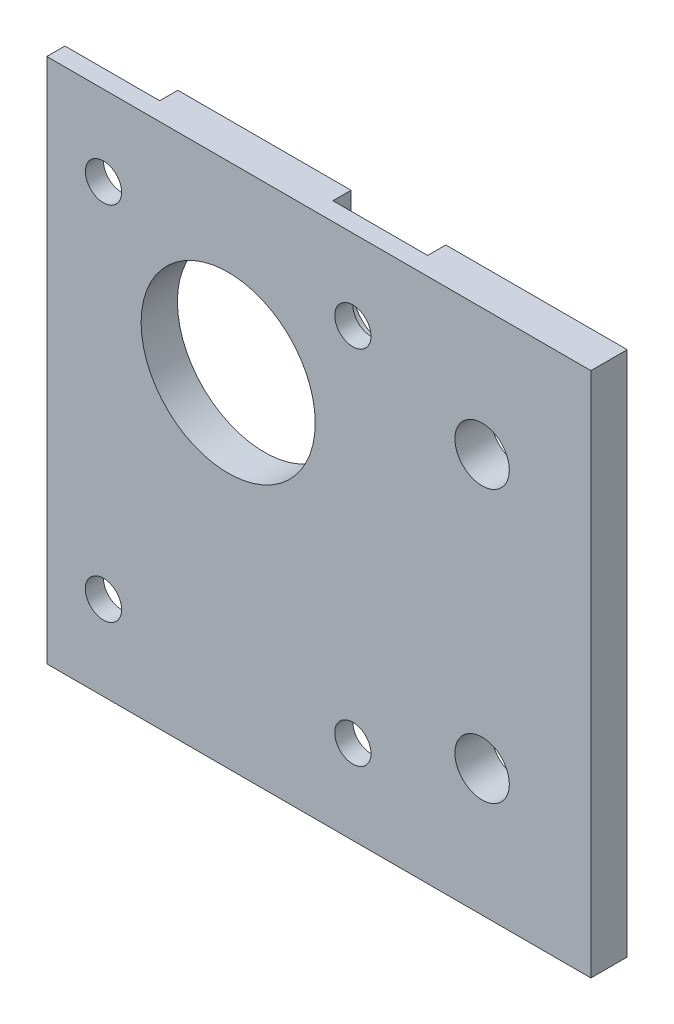
ISO-10303-21;
HEADER;
FILE_DESCRIPTION(('STEP AP214'),'2;1');
FILE_NAME('part.step','',(''),(''),'','','');
FILE_SCHEMA(('AUTOMOTIVE_DESIGN { 1 0 10303 214 1 1 1 1 }'));
ENDSEC;
DATA;
#1=APPLICATION_CONTEXT('core data for automotive mechanical design processes');
#2=APPLICATION_PROTOCOL_DEFINITION('international standard','automotive_design',2000,#1);
#3=PRODUCT_CONTEXT('',#1,'mechanical');
#4=PRODUCT('Part','Part','',(#3));
#5=PRODUCT_RELATED_PRODUCT_CATEGORY('part','',(#4));
#6=PRODUCT_DEFINITION_FORMATION('','',#4);
#7=PRODUCT_DEFINITION_CONTEXT('part definition',#1,'design');
#8=PRODUCT_DEFINITION('design','',#6,#7);
#9=PRODUCT_DEFINITION_SHAPE('','',#8);
#10=(LENGTH_UNIT() NAMED_UNIT(*) SI_UNIT(.MILLI.,.METRE.));
#11=(NAMED_UNIT(*) PLANE_ANGLE_UNIT() SI_UNIT($,.RADIAN.));
#12=(NAMED_UNIT(*) SI_UNIT($,.STERADIAN.) SOLID_ANGLE_UNIT());
#13=UNCERTAINTY_MEASURE_WITH_UNIT(LENGTH_MEASURE(1.E-05),#10,'distance_accuracy_value','');
#14=(GEOMETRIC_REPRESENTATION_CONTEXT(3) GLOBAL_UNCERTAINTY_ASSIGNED_CONTEXT((#13)) GLOBAL_UNIT_ASSIGNED_CONTEXT((#10,
#11,#12)) REPRESENTATION_CONTEXT('',''));
#15=CARTESIAN_POINT('',(0.,0.,0.));
#16=DIRECTION('',(0.,0.,1.));
#17=DIRECTION('',(1.,0.,0.));
#18=AXIS2_PLACEMENT_3D('',#15,#16,#17);
#19=CARTESIAN_POINT('',(-9.67691762911674,-16.8,2.));
#20=DIRECTION('',(0.,0.,-1.));
#21=DIRECTION('',(-1.,0.,0.));
#22=AXIS2_PLACEMENT_3D('',#19,#20,#21);
#23=CYLINDRICAL_SURFACE('',#22,4.2);
#24=CARTESIAN_POINT('',(-9.67691762911674,-16.8,0.));
#25=DIRECTION('',(0.,0.,1.));
#26=DIRECTION('',(1.,0.,0.));
#27=AXIS2_PLACEMENT_3D('',#24,#25,#26);
#28=CIRCLE('',#27,4.2);
#29=CARTESIAN_POINT('',(-7.24091762911673,-20.2213891915419,0.));
#30=VERTEX_POINT('',#29);
#31=CARTESIAN_POINT('',(-12.1129176291167,-13.3786108084581,0.));
#32=VERTEX_POINT('',#31);
#33=EDGE_CURVE('E325',#30,#32,#28,.T.);
#34=ORIENTED_EDGE('',*,*,#33,.F.);
#35=DIRECTION('',(0.,0.,-1.));
#36=VECTOR('',#35,1.);
#37=CARTESIAN_POINT('',(-7.24091762911673,-20.2213891915419,2.));
#38=LINE('',#37,#36);
#39=CARTESIAN_POINT('',(-7.24091762911673,-20.2213891915419,2.));
#40=VERTEX_POINT('',#39);
#41=EDGE_CURVE('E11',#40,#30,#38,.T.);
#42=ORIENTED_EDGE('',*,*,#41,.F.);
#43=CARTESIAN_POINT('',(-9.67691762911674,-16.8,2.));
#44=DIRECTION('',(0.,0.,1.));
#45=DIRECTION('',(1.,0.,0.));
#46=AXIS2_PLACEMENT_3D('',#43,#44,#45);
#47=CIRCLE('',#46,4.2);
#48=CARTESIAN_POINT('',(-12.1129176291167,-13.3786108084581,2.));
#49=VERTEX_POINT('',#48);
#50=EDGE_CURVE('E259',#40,#49,#47,.T.);
#51=ORIENTED_EDGE('',*,*,#50,.T.);
#52=DIRECTION('',(0.,0.,-1.));
#53=VECTOR('',#52,1.);
#54=CARTESIAN_POINT('',(-12.1129176291167,-13.3786108084581,2.));
#55=LINE('',#54,#53);
#56=EDGE_CURVE('E134',#49,#32,#55,.T.);
#57=ORIENTED_EDGE('',*,*,#56,.T.);
#58=EDGE_LOOP('',(#34,#42,#51,#57));
#59=FACE_BOUND('',#58,.T.);
#60=ADVANCED_FACE('F40',(#59),#23,.F.);
#61=CARTESIAN_POINT('',(7.11830783394242,-9.99774280998314,2.));
#62=DIRECTION('',(-0.58,0.814616474176652,0.));
#63=DIRECTION('',(-0.814616474176652,-0.58,0.));
#64=AXIS2_PLACEMENT_3D('',#61,#62,#63);
#65=PLANE('',#64);
#66=DIRECTION('',(0.814616474176652,0.58,0.));
#67=VECTOR('',#66,1.);
#68=CARTESIAN_POINT('',(7.11830783394242,-9.99774280998314,0.));
#69=LINE('',#68,#67);
#70=CARTESIAN_POINT('',(-11.314,-23.1213891915419,0.));
#71=VERTEX_POINT('',#70);
#72=EDGE_CURVE('E329',#71,#30,#69,.T.);
#73=ORIENTED_EDGE('',*,*,#72,.F.);
#74=DIRECTION('',(0.,0.,-1.));
#75=VECTOR('',#74,1.);
#76=CARTESIAN_POINT('',(-11.314,-23.1213891915419,2.));
#77=LINE('',#76,#75);
#78=CARTESIAN_POINT('',(-11.314,-23.1213891915419,2.));
#79=VERTEX_POINT('',#78);
#80=EDGE_CURVE('E50',#79,#71,#77,.T.);
#81=ORIENTED_EDGE('',*,*,#80,.F.);
#82=DIRECTION('',(0.814616474176652,0.58,0.));
#83=VECTOR('',#82,1.);
#84=CARTESIAN_POINT('',(7.11830783394242,-9.99774280998314,2.));
#85=LINE('',#84,#83);
#86=EDGE_CURVE('E262',#79,#40,#85,.T.);
#87=ORIENTED_EDGE('',*,*,#86,.T.);
#88=ORIENTED_EDGE('',*,*,#41,.T.);
#89=EDGE_LOOP('',(#73,#81,#87,#88));
#90=FACE_BOUND('',#89,.T.);
#91=ADVANCED_FACE('F469',(#90),#65,.T.);
#92=CARTESIAN_POINT('',(-11.314,0.,2.));
#93=DIRECTION('',(-1.,0.,0.));
#94=DIRECTION('',(0.,0.,1.));
#95=AXIS2_PLACEMENT_3D('',#92,#93,#94);
#96=PLANE('',#95);
#97=DIRECTION('',(0.,1.,0.));
#98=VECTOR('',#97,1.);
#99=CARTESIAN_POINT('',(-11.314,0.,0.));
#100=LINE('',#99,#98);
#101=CARTESIAN_POINT('',(-11.314,-29.,0.));
#102=VERTEX_POINT('',#101);
#103=EDGE_CURVE('E333',#102,#71,#100,.T.);
#104=ORIENTED_EDGE('',*,*,#103,.F.);
#105=DIRECTION('',(0.,0.,-1.));
#106=VECTOR('',#105,1.);
#107=CARTESIAN_POINT('',(-11.314,-29.,2.));
#108=LINE('',#107,#106);
#109=CARTESIAN_POINT('',(-11.314,-29.,2.));
#110=VERTEX_POINT('',#109);
#111=EDGE_CURVE('E459',#110,#102,#108,.T.);
#112=ORIENTED_EDGE('',*,*,#111,.F.);
#113=DIRECTION('',(0.,1.,0.));
#114=VECTOR('',#113,1.);
#115=CARTESIAN_POINT('',(-11.314,0.,2.));
#116=LINE('',#115,#114);
#117=EDGE_CURVE('E266',#110,#79,#116,.T.);
#118=ORIENTED_EDGE('',*,*,#117,.T.);
#119=ORIENTED_EDGE('',*,*,#80,.T.);
#120=EDGE_LOOP('',(#104,#112,#118,#119));
#121=FACE_BOUND('',#120,.T.);
#122=ADVANCED_FACE('F465',(#121),#96,.T.);
#123=CARTESIAN_POINT('',(9.54999999999998,0.,2.));
#124=DIRECTION('',(1.,0.,0.));
#125=DIRECTION('',(0.,1.,0.));
#126=AXIS2_PLACEMENT_3D('',#123,#124,#125);
#127=PLANE('',#126);
#128=DIRECTION('',(0.,-1.,0.));
#129=VECTOR('',#128,1.);
#130=CARTESIAN_POINT('',(9.54999999999998,0.,0.));
#131=LINE('',#130,#129);
#132=CARTESIAN_POINT('',(9.55,-19.7,0.));
#133=VERTEX_POINT('',#132);
#134=CARTESIAN_POINT('',(9.55,-29.,0.));
#135=VERTEX_POINT('',#134);
#136=EDGE_CURVE('E341',#133,#135,#131,.T.);
#137=ORIENTED_EDGE('',*,*,#136,.F.);
#138=DIRECTION('',(0.,0.,-1.));
#139=VECTOR('',#138,1.);
#140=CARTESIAN_POINT('',(9.55,-19.7,2.));
#141=LINE('',#140,#139);
#142=CARTESIAN_POINT('',(9.55,-19.7,2.));
#143=VERTEX_POINT('',#142);
#144=EDGE_CURVE('E453',#143,#133,#141,.T.);
#145=ORIENTED_EDGE('',*,*,#144,.F.);
#146=DIRECTION('',(0.,-1.,0.));
#147=VECTOR('',#146,1.);
#148=CARTESIAN_POINT('',(9.54999999999998,0.,2.));
#149=LINE('',#148,#147);
#150=CARTESIAN_POINT('',(9.55,-29.,2.));
#151=VERTEX_POINT('',#150);
#152=EDGE_CURVE('E270',#143,#151,#149,.T.);
#153=ORIENTED_EDGE('',*,*,#152,.T.);
#154=DIRECTION('',(0.,0.,-1.));
#155=VECTOR('',#154,1.);
#156=CARTESIAN_POINT('',(9.55,-29.,2.));
#157=LINE('',#156,#155);
#158=EDGE_CURVE('E456',#151,#135,#157,.T.);
#159=ORIENTED_EDGE('',*,*,#158,.T.);
#160=EDGE_LOOP('',(#137,#145,#153,#159));
#161=FACE_BOUND('',#160,.T.);
#162=ADVANCED_FACE('F542',(#161),#127,.T.);
#163=CARTESIAN_POINT('',(13.75,-19.7,2.));
#164=DIRECTION('',(0.,0.,-1.));
#165=DIRECTION('',(-1.,0.,0.));
#166=AXIS2_PLACEMENT_3D('',#163,#164,#165);
#167=CYLINDRICAL_SURFACE('',#166,4.2);
#168=CARTESIAN_POINT('',(13.75,-19.7,0.));
#169=DIRECTION('',(0.,0.,1.));
#170=DIRECTION('',(1.,0.,0.));
#171=AXIS2_PLACEMENT_3D('',#168,#169,#170);
#172=CIRCLE('',#171,4.2);
#173=CARTESIAN_POINT('',(13.75,-15.5,0.));
#174=VERTEX_POINT('',#173);
#175=EDGE_CURVE('E345',#174,#133,#172,.T.);
#176=ORIENTED_EDGE('',*,*,#175,.F.);
#177=DIRECTION('',(0.,0.,-1.));
#178=VECTOR('',#177,1.);
#179=CARTESIAN_POINT('',(13.75,-15.5,2.));
#180=LINE('',#179,#178);
#181=CARTESIAN_POINT('',(13.75,-15.5,2.));
#182=VERTEX_POINT('',#181);
#183=EDGE_CURVE('E450',#182,#174,#180,.T.);
#184=ORIENTED_EDGE('',*,*,#183,.F.);
#185=CARTESIAN_POINT('',(13.75,-19.7,2.));
#186=DIRECTION('',(0.,0.,1.));
#187=DIRECTION('',(1.,0.,0.));
#188=AXIS2_PLACEMENT_3D('',#185,#186,#187);
#189=CIRCLE('',#188,4.2);
#190=EDGE_CURVE('E274',#182,#143,#189,.T.);
#191=ORIENTED_EDGE('',*,*,#190,.T.);
#192=ORIENTED_EDGE('',*,*,#144,.T.);
#193=EDGE_LOOP('',(#176,#184,#191,#192));
#194=FACE_BOUND('',#193,.T.);
#195=ADVANCED_FACE('F537',(#194),#167,.F.);
#196=CARTESIAN_POINT('',(0.,-15.5,2.));
#197=DIRECTION('',(0.,1.,0.));
#198=DIRECTION('',(-1.,0.,0.));
#199=AXIS2_PLACEMENT_3D('',#196,#197,#198);
#200=PLANE('',#199);
#201=DIRECTION('',(1.,0.,0.));
#202=VECTOR('',#201,1.);
#203=CARTESIAN_POINT('',(0.,-15.5,0.));
#204=LINE('',#203,#202);
#205=CARTESIAN_POINT('',(20.,-15.5,0.));
#206=VERTEX_POINT('',#205);
#207=EDGE_CURVE('E349',#174,#206,#204,.T.);
#208=ORIENTED_EDGE('',*,*,#207,.T.);
#209=DIRECTION('',(0.,0.,-1.));
#210=VECTOR('',#209,1.);
#211=CARTESIAN_POINT('',(20.,-15.5,2.));
#212=LINE('',#211,#210);
#213=CARTESIAN_POINT('',(20.,-15.5,2.));
#214=VERTEX_POINT('',#213);
#215=EDGE_CURVE('E447',#214,#206,#212,.T.);
#216=ORIENTED_EDGE('',*,*,#215,.F.);
#217=DIRECTION('',(1.,0.,0.));
#218=VECTOR('',#217,1.);
#219=CARTESIAN_POINT('',(0.,-15.5,2.));
#220=LINE('',#219,#218);
#221=EDGE_CURVE('E278',#182,#214,#220,.T.);
#222=ORIENTED_EDGE('',*,*,#221,.F.);
#223=ORIENTED_EDGE('',*,*,#183,.T.);
#224=EDGE_LOOP('',(#208,#216,#222,#223));
#225=FACE_BOUND('',#224,.T.);
#226=ADVANCED_FACE('F546',(#225),#200,.F.);
#227=CARTESIAN_POINT('',(20.,0.,2.));
#228=DIRECTION('',(-1.,0.,0.));
#229=DIRECTION('',(0.,-1.,0.));
#230=AXIS2_PLACEMENT_3D('',#227,#228,#229);
#231=PLANE('',#230);
#232=DIRECTION('',(0.,1.,0.));
#233=VECTOR('',#232,1.);
#234=CARTESIAN_POINT('',(20.,0.,0.));
#235=LINE('',#234,#233);
#236=CARTESIAN_POINT('',(20.,-29.,0.));
#237=VERTEX_POINT('',#236);
#238=EDGE_CURVE('E353',#237,#206,#235,.T.);
#239=ORIENTED_EDGE('',*,*,#238,.F.);
#240=DIRECTION('',(0.,0.,-1.));
#241=VECTOR('',#240,1.);
#242=CARTESIAN_POINT('',(20.,-29.,2.));
#243=LINE('',#242,#241);
#244=CARTESIAN_POINT('',(20.,-29.,2.));
#245=VERTEX_POINT('',#244);
#246=EDGE_CURVE('E444',#245,#237,#243,.T.);
#247=ORIENTED_EDGE('',*,*,#246,.F.);
#248=DIRECTION('',(0.,1.,0.));
#249=VECTOR('',#248,1.);
#250=CARTESIAN_POINT('',(20.,0.,2.));
#251=LINE('',#250,#249);
#252=EDGE_CURVE('E282',#245,#214,#251,.T.);
#253=ORIENTED_EDGE('',*,*,#252,.T.);
#254=ORIENTED_EDGE('',*,*,#215,.T.);
#255=EDGE_LOOP('',(#239,#247,#253,#254));
#256=FACE_BOUND('',#255,.T.);
#257=ADVANCED_FACE('F532',(#256),#231,.T.);
#258=CARTESIAN_POINT('',(0.,-29.,2.));
#259=DIRECTION('',(0.,-1.,0.));
#260=DIRECTION('',(0.,0.,-1.));
#261=AXIS2_PLACEMENT_3D('',#258,#259,#260);
#262=PLANE('',#261);
#263=DIRECTION('',(-1.,0.,0.));
#264=VECTOR('',#263,1.);
#265=CARTESIAN_POINT('',(0.,-29.,0.));
#266=LINE('',#265,#264);
#267=CARTESIAN_POINT('',(40.,-29.,0.));
#268=VERTEX_POINT('',#267);
#269=EDGE_CURVE('E357',#268,#237,#266,.T.);
#270=ORIENTED_EDGE('',*,*,#269,.F.);
#271=DIRECTION('',(0.,0.,-1.));
#272=VECTOR('',#271,1.);
#273=CARTESIAN_POINT('',(40.,-29.,2.));
#274=LINE('',#273,#272);
#275=CARTESIAN_POINT('',(40.,-29.,4.));
#276=VERTEX_POINT('',#275);
#277=EDGE_CURVE('E441',#276,#268,#274,.T.);
#278=ORIENTED_EDGE('',*,*,#277,.F.);
#279=DIRECTION('',(1.,0.,0.));
#280=VECTOR('',#279,1.);
#281=CARTESIAN_POINT('',(-20.,-29.,4.));
#282=LINE('',#281,#280);
#283=CARTESIAN_POINT('',(-20.,-29.,4.));
#284=VERTEX_POINT('',#283);
#285=EDGE_CURVE('E634',#284,#276,#282,.T.);
#286=ORIENTED_EDGE('',*,*,#285,.F.);
#287=DIRECTION('',(0.,0.,-1.));
#288=VECTOR('',#287,1.);
#289=CARTESIAN_POINT('',(-20.,-29.,4.));
#290=LINE('',#289,#288);
#291=CARTESIAN_POINT('',(-20.,-29.,2.));
#292=VERTEX_POINT('',#291);
#293=EDGE_CURVE('E246',#284,#292,#290,.T.);
#294=ORIENTED_EDGE('',*,*,#293,.T.);
#295=DIRECTION('',(1.,0.,0.));
#296=VECTOR('',#295,1.);
#297=CARTESIAN_POINT('',(-20.,-29.,2.));
#298=LINE('',#297,#296);
#299=EDGE_CURVE('E229',#292,#110,#298,.T.);
#300=ORIENTED_EDGE('',*,*,#299,.T.);
#301=ORIENTED_EDGE('',*,*,#111,.T.);
#302=DIRECTION('',(-1.,0.,0.));
#303=VECTOR('',#302,1.);
#304=CARTESIAN_POINT('',(0.,-29.,0.));
#305=LINE('',#304,#303);
#306=EDGE_CURVE('E337',#135,#102,#305,.T.);
#307=ORIENTED_EDGE('',*,*,#306,.F.);
#308=ORIENTED_EDGE('',*,*,#158,.F.);
#309=EDGE_CURVE('E223',#151,#245,#298,.T.);
#310=ORIENTED_EDGE('',*,*,#309,.T.);
#311=ORIENTED_EDGE('',*,*,#246,.T.);
#312=EDGE_LOOP('',(#270,#278,#286,#294,#300,#301,#307,#308,#310,#311));
#313=FACE_BOUND('',#312,.T.);
#314=ADVANCED_FACE('F476',(#313),#262,.T.);
#315=CARTESIAN_POINT('',(40.,0.,2.));
#316=DIRECTION('',(1.,0.,0.));
#317=DIRECTION('',(0.,1.,0.));
#318=AXIS2_PLACEMENT_3D('',#315,#316,#317);
#319=PLANE('',#318);
#320=DIRECTION('',(0.,-1.,0.));
#321=VECTOR('',#320,1.);
#322=CARTESIAN_POINT('',(40.,0.,0.));
#323=LINE('',#322,#321);
#324=CARTESIAN_POINT('',(40.,29.,0.));
#325=VERTEX_POINT('',#324);
#326=EDGE_CURVE('E361',#325,#268,#323,.T.);
#327=ORIENTED_EDGE('',*,*,#326,.F.);
#328=DIRECTION('',(0.,0.,-1.));
#329=VECTOR('',#328,1.);
#330=CARTESIAN_POINT('',(40.,29.,2.));
#331=LINE('',#330,#329);
#332=CARTESIAN_POINT('',(40.,29.,4.));
#333=VERTEX_POINT('',#332);
#334=EDGE_CURVE('E438',#333,#325,#331,.T.);
#335=ORIENTED_EDGE('',*,*,#334,.F.);
#336=DIRECTION('',(0.,1.,0.));
#337=VECTOR('',#336,1.);
#338=CARTESIAN_POINT('',(40.,-29.,4.));
#339=LINE('',#338,#337);
#340=EDGE_CURVE('E525',#276,#333,#339,.T.);
#341=ORIENTED_EDGE('',*,*,#340,.F.);
#342=ORIENTED_EDGE('',*,*,#277,.T.);
#343=EDGE_LOOP('',(#327,#335,#341,#342));
#344=FACE_BOUND('',#343,.T.);
#345=ADVANCED_FACE('F519',(#344),#319,.T.);
#346=CARTESIAN_POINT('',(20.,0.,2.));
#347=DIRECTION('',(-1.,0.,0.));
#348=DIRECTION('',(0.,0.,1.));
#349=AXIS2_PLACEMENT_3D('',#346,#347,#348);
#350=PLANE('',#349);
#351=DIRECTION('',(0.,1.,0.));
#352=VECTOR('',#351,1.);
#353=CARTESIAN_POINT('',(20.,0.,0.));
#354=LINE('',#353,#352);
#355=CARTESIAN_POINT('',(20.,15.95,0.));
#356=VERTEX_POINT('',#355);
#357=CARTESIAN_POINT('',(20.,29.,0.));
#358=VERTEX_POINT('',#357);
#359=EDGE_CURVE('E369',#356,#358,#354,.T.);
#360=ORIENTED_EDGE('',*,*,#359,.F.);
#361=DIRECTION('',(0.,0.,-1.));
#362=VECTOR('',#361,1.);
#363=CARTESIAN_POINT('',(20.,15.95,2.));
#364=LINE('',#363,#362);
#365=CARTESIAN_POINT('',(20.,15.95,2.));
#366=VERTEX_POINT('',#365);
#367=EDGE_CURVE('E432',#366,#356,#364,.T.);
#368=ORIENTED_EDGE('',*,*,#367,.F.);
#369=DIRECTION('',(0.,1.,0.));
#370=VECTOR('',#369,1.);
#371=CARTESIAN_POINT('',(20.,0.,2.));
#372=LINE('',#371,#370);
#373=CARTESIAN_POINT('',(20.,29.,2.));
#374=VERTEX_POINT('',#373);
#375=EDGE_CURVE('E286',#366,#374,#372,.T.);
#376=ORIENTED_EDGE('',*,*,#375,.T.);
#377=DIRECTION('',(0.,0.,-1.));
#378=VECTOR('',#377,1.);
#379=CARTESIAN_POINT('',(20.,29.,2.));
#380=LINE('',#379,#378);
#381=EDGE_CURVE('E435',#374,#358,#380,.T.);
#382=ORIENTED_EDGE('',*,*,#381,.T.);
#383=EDGE_LOOP('',(#360,#368,#376,#382));
#384=FACE_BOUND('',#383,.T.);
#385=ADVANCED_FACE('F513',(#384),#350,.T.);
#386=CARTESIAN_POINT('',(0.,15.9500000000001,2.));
#387=DIRECTION('',(0.,1.,0.));
#388=DIRECTION('',(-1.,0.,0.));
#389=AXIS2_PLACEMENT_3D('',#386,#387,#388);
#390=PLANE('',#389);
#391=DIRECTION('',(1.,0.,0.));
#392=VECTOR('',#391,1.);
#393=CARTESIAN_POINT('',(0.,15.9500000000001,0.));
#394=LINE('',#393,#392);
#395=CARTESIAN_POINT('',(13.75,15.95,0.));
#396=VERTEX_POINT('',#395);
#397=EDGE_CURVE('E373',#396,#356,#394,.T.);
#398=ORIENTED_EDGE('',*,*,#397,.F.);
#399=DIRECTION('',(0.,0.,-1.));
#400=VECTOR('',#399,1.);
#401=CARTESIAN_POINT('',(13.75,15.95,2.));
#402=LINE('',#401,#400);
#403=CARTESIAN_POINT('',(13.75,15.95,2.));
#404=VERTEX_POINT('',#403);
#405=EDGE_CURVE('E429',#404,#396,#402,.T.);
#406=ORIENTED_EDGE('',*,*,#405,.F.);
#407=DIRECTION('',(1.,0.,0.));
#408=VECTOR('',#407,1.);
#409=CARTESIAN_POINT('',(0.,15.9500000000001,2.));
#410=LINE('',#409,#408);
#411=EDGE_CURVE('E290',#404,#366,#410,.T.);
#412=ORIENTED_EDGE('',*,*,#411,.T.);
#413=ORIENTED_EDGE('',*,*,#367,.T.);
#414=EDGE_LOOP('',(#398,#406,#412,#413));
#415=FACE_BOUND('',#414,.T.);
#416=ADVANCED_FACE('F510',(#415),#390,.T.);
#417=CARTESIAN_POINT('',(13.75,20.15,2.));
#418=DIRECTION('',(0.,0.,-1.));
#419=DIRECTION('',(-1.,0.,0.));
#420=AXIS2_PLACEMENT_3D('',#417,#418,#419);
#421=CYLINDRICAL_SURFACE('',#420,4.19999999999999);
#422=CARTESIAN_POINT('',(13.75,20.15,0.));
#423=DIRECTION('',(0.,0.,1.));
#424=DIRECTION('',(1.,0.,0.));
#425=AXIS2_PLACEMENT_3D('',#422,#423,#424);
#426=CIRCLE('',#425,4.19999999999999);
#427=CARTESIAN_POINT('',(9.55000000000001,20.15,0.));
#428=VERTEX_POINT('',#427);
#429=EDGE_CURVE('E377',#428,#396,#426,.T.);
#430=ORIENTED_EDGE('',*,*,#429,.F.);
#431=DIRECTION('',(0.,0.,-1.));
#432=VECTOR('',#431,1.);
#433=CARTESIAN_POINT('',(9.55000000000001,20.15,2.));
#434=LINE('',#433,#432);
#435=CARTESIAN_POINT('',(9.55000000000001,20.15,2.));
#436=VERTEX_POINT('',#435);
#437=EDGE_CURVE('E426',#436,#428,#434,.T.);
#438=ORIENTED_EDGE('',*,*,#437,.F.);
#439=CARTESIAN_POINT('',(13.75,20.15,2.));
#440=DIRECTION('',(0.,0.,1.));
#441=DIRECTION('',(1.,0.,0.));
#442=AXIS2_PLACEMENT_3D('',#439,#440,#441);
#443=CIRCLE('',#442,4.19999999999999);
#444=EDGE_CURVE('E294',#436,#404,#443,.T.);
#445=ORIENTED_EDGE('',*,*,#444,.T.);
#446=ORIENTED_EDGE('',*,*,#405,.T.);
#447=EDGE_LOOP('',(#430,#438,#445,#446));
#448=FACE_BOUND('',#447,.T.);
#449=ADVANCED_FACE('F505',(#448),#421,.F.);
#450=CARTESIAN_POINT('',(9.55000000000001,0.,2.));
#451=DIRECTION('',(-1.,0.,0.));
#452=DIRECTION('',(0.,0.,1.));
#453=AXIS2_PLACEMENT_3D('',#450,#451,#452);
#454=PLANE('',#453);
#455=DIRECTION('',(0.,1.,0.));
#456=VECTOR('',#455,1.);
#457=CARTESIAN_POINT('',(9.55000000000001,0.,0.));
#458=LINE('',#457,#456);
#459=CARTESIAN_POINT('',(9.55000000000001,29.,0.));
#460=VERTEX_POINT('',#459);
#461=EDGE_CURVE('E381',#428,#460,#458,.T.);
#462=ORIENTED_EDGE('',*,*,#461,.T.);
#463=DIRECTION('',(0.,0.,-1.));
#464=VECTOR('',#463,1.);
#465=CARTESIAN_POINT('',(9.55000000000001,29.,2.));
#466=LINE('',#465,#464);
#467=CARTESIAN_POINT('',(9.55000000000001,29.,2.));
#468=VERTEX_POINT('',#467);
#469=EDGE_CURVE('E422',#468,#460,#466,.T.);
#470=ORIENTED_EDGE('',*,*,#469,.F.);
#471=DIRECTION('',(0.,1.,0.));
#472=VECTOR('',#471,1.);
#473=CARTESIAN_POINT('',(9.55000000000001,0.,2.));
#474=LINE('',#473,#472);
#475=EDGE_CURVE('E298',#436,#468,#474,.T.);
#476=ORIENTED_EDGE('',*,*,#475,.F.);
#477=ORIENTED_EDGE('',*,*,#437,.T.);
#478=EDGE_LOOP('',(#462,#470,#476,#477));
#479=FACE_BOUND('',#478,.T.);
#480=ADVANCED_FACE('F502',(#479),#454,.F.);
#481=CARTESIAN_POINT('',(0.,29.,2.));
#482=DIRECTION('',(0.,-1.,0.));
#483=DIRECTION('',(0.,0.,-1.));
#484=AXIS2_PLACEMENT_3D('',#481,#482,#483);
#485=PLANE('',#484);
#486=DIRECTION('',(-1.,0.,0.));
#487=VECTOR('',#486,1.);
#488=CARTESIAN_POINT('',(0.,29.,0.));
#489=LINE('',#488,#487);
#490=CARTESIAN_POINT('',(-9.55,29.,0.));
#491=VERTEX_POINT('',#490);
#492=EDGE_CURVE('E385',#460,#491,#489,.T.);
#493=ORIENTED_EDGE('',*,*,#492,.T.);
#494=DIRECTION('',(0.,0.,-1.));
#495=VECTOR('',#494,1.);
#496=CARTESIAN_POINT('',(-9.55,29.,2.));
#497=LINE('',#496,#495);
#498=CARTESIAN_POINT('',(-9.55,29.,2.));
#499=VERTEX_POINT('',#498);
#500=EDGE_CURVE('E419',#499,#491,#497,.T.);
#501=ORIENTED_EDGE('',*,*,#500,.F.);
#502=DIRECTION('',(-1.,0.,0.));
#503=VECTOR('',#502,1.);
#504=CARTESIAN_POINT('',(-20.,29.,2.));
#505=LINE('',#504,#503);
#506=CARTESIAN_POINT('',(-20.,29.,2.));
#507=VERTEX_POINT('',#506);
#508=EDGE_CURVE('E239',#499,#507,#505,.T.);
#509=ORIENTED_EDGE('',*,*,#508,.T.);
#510=DIRECTION('',(0.,0.,-1.));
#511=VECTOR('',#510,1.);
#512=CARTESIAN_POINT('',(-20.,29.,4.));
#513=LINE('',#512,#511);
#514=CARTESIAN_POINT('',(-20.,29.,4.));
#515=VERTEX_POINT('',#514);
#516=EDGE_CURVE('E221',#515,#507,#513,.T.);
#517=ORIENTED_EDGE('',*,*,#516,.F.);
#518=DIRECTION('',(-1.,0.,0.));
#519=VECTOR('',#518,1.);
#520=CARTESIAN_POINT('',(-20.,29.,4.));
#521=LINE('',#520,#519);
#522=EDGE_CURVE('E234',#333,#515,#521,.T.);
#523=ORIENTED_EDGE('',*,*,#522,.F.);
#524=ORIENTED_EDGE('',*,*,#334,.T.);
#525=DIRECTION('',(1.,0.,0.));
#526=VECTOR('',#525,1.);
#527=CARTESIAN_POINT('',(0.,29.,0.));
#528=LINE('',#527,#526);
#529=EDGE_CURVE('E365',#358,#325,#528,.T.);
#530=ORIENTED_EDGE('',*,*,#529,.F.);
#531=ORIENTED_EDGE('',*,*,#381,.F.);
#532=EDGE_CURVE('E243',#374,#468,#505,.T.);
#533=ORIENTED_EDGE('',*,*,#532,.T.);
#534=ORIENTED_EDGE('',*,*,#469,.T.);
#535=EDGE_LOOP('',(#493,#501,#509,#517,#523,#524,#530,#531,#533,#534));
#536=FACE_BOUND('',#535,.T.);
#537=ADVANCED_FACE('F498',(#536),#485,.F.);
#538=CARTESIAN_POINT('',(-9.55,0.,2.));
#539=DIRECTION('',(-1.,0.,0.));
#540=DIRECTION('',(0.,0.,1.));
#541=AXIS2_PLACEMENT_3D('',#538,#539,#540);
#542=PLANE('',#541);
#543=DIRECTION('',(0.,1.,0.));
#544=VECTOR('',#543,1.);
#545=CARTESIAN_POINT('',(-9.55,0.,0.));
#546=LINE('',#545,#544);
#547=CARTESIAN_POINT('',(-9.55,20.15,0.));
#548=VERTEX_POINT('',#547);
#549=EDGE_CURVE('E389',#548,#491,#546,.T.);
#550=ORIENTED_EDGE('',*,*,#549,.F.);
#551=DIRECTION('',(0.,0.,-1.));
#552=VECTOR('',#551,1.);
#553=CARTESIAN_POINT('',(-9.55,20.15,2.));
#554=LINE('',#553,#552);
#555=CARTESIAN_POINT('',(-9.55,20.15,2.));
#556=VERTEX_POINT('',#555);
#557=EDGE_CURVE('E416',#556,#548,#554,.T.);
#558=ORIENTED_EDGE('',*,*,#557,.F.);
#559=DIRECTION('',(0.,1.,0.));
#560=VECTOR('',#559,1.);
#561=CARTESIAN_POINT('',(-9.55,0.,2.));
#562=LINE('',#561,#560);
#563=EDGE_CURVE('E302',#556,#499,#562,.T.);
#564=ORIENTED_EDGE('',*,*,#563,.T.);
#565=ORIENTED_EDGE('',*,*,#500,.T.);
#566=EDGE_LOOP('',(#550,#558,#564,#565));
#567=FACE_BOUND('',#566,.T.);
#568=ADVANCED_FACE('F493',(#567),#542,.T.);
#569=CARTESIAN_POINT('',(-13.75,20.15,2.));
#570=DIRECTION('',(0.,0.,-1.));
#571=DIRECTION('',(-1.,0.,0.));
#572=AXIS2_PLACEMENT_3D('',#569,#570,#571);
#573=CYLINDRICAL_SURFACE('',#572,4.2);
#574=CARTESIAN_POINT('',(-13.75,20.15,0.));
#575=DIRECTION('',(0.,0.,1.));
#576=DIRECTION('',(1.,0.,0.));
#577=AXIS2_PLACEMENT_3D('',#574,#575,#576);
#578=CIRCLE('',#577,4.2);
#579=CARTESIAN_POINT('',(-13.75,15.95,0.));
#580=VERTEX_POINT('',#579);
#581=EDGE_CURVE('E393',#580,#548,#578,.T.);
#582=ORIENTED_EDGE('',*,*,#581,.F.);
#583=DIRECTION('',(0.,0.,-1.));
#584=VECTOR('',#583,1.);
#585=CARTESIAN_POINT('',(-13.75,15.95,2.));
#586=LINE('',#585,#584);
#587=CARTESIAN_POINT('',(-13.75,15.95,2.));
#588=VERTEX_POINT('',#587);
#589=EDGE_CURVE('E201',#588,#580,#586,.T.);
#590=ORIENTED_EDGE('',*,*,#589,.F.);
#591=CARTESIAN_POINT('',(-13.75,20.15,2.));
#592=DIRECTION('',(0.,0.,1.));
#593=DIRECTION('',(1.,0.,0.));
#594=AXIS2_PLACEMENT_3D('',#591,#592,#593);
#595=CIRCLE('',#594,4.2);
#596=EDGE_CURVE('E213',#588,#556,#595,.T.);
#597=ORIENTED_EDGE('',*,*,#596,.T.);
#598=ORIENTED_EDGE('',*,*,#557,.T.);
#599=EDGE_LOOP('',(#582,#590,#597,#598));
#600=FACE_BOUND('',#599,.T.);
#601=ADVANCED_FACE('F490',(#600),#573,.F.);
#602=CARTESIAN_POINT('',(0.,15.95,2.));
#603=DIRECTION('',(0.,-1.,0.));
#604=DIRECTION('',(1.,0.,0.));
#605=AXIS2_PLACEMENT_3D('',#602,#603,#604);
#606=PLANE('',#605);
#607=DIRECTION('',(-1.,0.,0.));
#608=VECTOR('',#607,1.);
#609=CARTESIAN_POINT('',(0.,15.95,0.));
#610=LINE('',#609,#608);
#611=CARTESIAN_POINT('',(-20.,15.95,0.));
#612=VERTEX_POINT('',#611);
#613=EDGE_CURVE('E195',#580,#612,#610,.T.);
#614=ORIENTED_EDGE('',*,*,#613,.T.);
#615=DIRECTION('',(0.,0.,-1.));
#616=VECTOR('',#615,1.);
#617=CARTESIAN_POINT('',(-20.,15.95,2.));
#618=LINE('',#617,#616);
#619=CARTESIAN_POINT('',(-20.,15.95,2.));
#620=VERTEX_POINT('',#619);
#621=EDGE_CURVE('E189',#620,#612,#618,.T.);
#622=ORIENTED_EDGE('',*,*,#621,.F.);
#623=DIRECTION('',(-1.,0.,0.));
#624=VECTOR('',#623,1.);
#625=CARTESIAN_POINT('',(0.,15.95,2.));
#626=LINE('',#625,#624);
#627=EDGE_CURVE('E192',#588,#620,#626,.T.);
#628=ORIENTED_EDGE('',*,*,#627,.F.);
#629=ORIENTED_EDGE('',*,*,#589,.T.);
#630=EDGE_LOOP('',(#614,#622,#628,#629));
#631=FACE_BOUND('',#630,.T.);
#632=ADVANCED_FACE('F191',(#631),#606,.F.);
#633=CARTESIAN_POINT('',(-20.,0.,2.));
#634=DIRECTION('',(-1.,0.,0.));
#635=DIRECTION('',(0.,0.,1.));
#636=AXIS2_PLACEMENT_3D('',#633,#634,#635);
#637=PLANE('',#636);
#638=DIRECTION('',(0.,1.,0.));
#639=VECTOR('',#638,1.);
#640=CARTESIAN_POINT('',(-20.,0.,0.));
#641=LINE('',#640,#639);
#642=CARTESIAN_POINT('',(-20.,-16.2786108084581,0.));
#643=VERTEX_POINT('',#642);
#644=EDGE_CURVE('E399',#643,#612,#641,.T.);
#645=ORIENTED_EDGE('',*,*,#644,.F.);
#646=DIRECTION('',(0.,0.,-1.));
#647=VECTOR('',#646,1.);
#648=CARTESIAN_POINT('',(-20.,-16.2786108084581,2.));
#649=LINE('',#648,#647);
#650=CARTESIAN_POINT('',(-20.,-16.2786108084581,2.));
#651=VERTEX_POINT('',#650);
#652=EDGE_CURVE('E202',#651,#643,#649,.T.);
#653=ORIENTED_EDGE('',*,*,#652,.F.);
#654=DIRECTION('',(0.,-1.,0.));
#655=VECTOR('',#654,1.);
#656=CARTESIAN_POINT('',(-20.,29.,2.));
#657=LINE('',#656,#655);
#658=EDGE_CURVE('E224',#651,#292,#657,.T.);
#659=ORIENTED_EDGE('',*,*,#658,.T.);
#660=ORIENTED_EDGE('',*,*,#293,.F.);
#661=DIRECTION('',(0.,-1.,0.));
#662=VECTOR('',#661,1.);
#663=CARTESIAN_POINT('',(-20.,29.,4.));
#664=LINE('',#663,#662);
#665=EDGE_CURVE('E630',#515,#284,#664,.T.);
#666=ORIENTED_EDGE('',*,*,#665,.F.);
#667=ORIENTED_EDGE('',*,*,#516,.T.);
#668=EDGE_CURVE('E211',#507,#620,#657,.T.);
#669=ORIENTED_EDGE('',*,*,#668,.T.);
#670=ORIENTED_EDGE('',*,*,#621,.T.);
#671=EDGE_LOOP('',(#645,#653,#659,#660,#666,#667,#669,#670));
#672=FACE_BOUND('',#671,.T.);
#673=ADVANCED_FACE('F218',(#672),#637,.T.);
#674=CARTESIAN_POINT('',(0.,-16.2786108084581,2.));
#675=DIRECTION('',(0.,-1.,0.));
#676=DIRECTION('',(1.,0.,0.));
#677=AXIS2_PLACEMENT_3D('',#674,#675,#676);
#678=PLANE('',#677);
#679=DIRECTION('',(-1.,0.,0.));
#680=VECTOR('',#679,1.);
#681=CARTESIAN_POINT('',(0.,-16.2786108084581,0.));
#682=LINE('',#681,#680);
#683=CARTESIAN_POINT('',(-16.186,-16.2786108084581,0.));
#684=VERTEX_POINT('',#683);
#685=EDGE_CURVE('E402',#684,#643,#682,.T.);
#686=ORIENTED_EDGE('',*,*,#685,.F.);
#687=DIRECTION('',(0.,0.,-1.));
#688=VECTOR('',#687,1.);
#689=CARTESIAN_POINT('',(-16.186,-16.2786108084581,2.));
#690=LINE('',#689,#688);
#691=CARTESIAN_POINT('',(-16.186,-16.2786108084581,2.));
#692=VERTEX_POINT('',#691);
#693=EDGE_CURVE('E58',#692,#684,#690,.T.);
#694=ORIENTED_EDGE('',*,*,#693,.F.);
#695=DIRECTION('',(-1.,0.,0.));
#696=VECTOR('',#695,1.);
#697=CARTESIAN_POINT('',(0.,-16.2786108084581,2.));
#698=LINE('',#697,#696);
#699=EDGE_CURVE('E215',#692,#651,#698,.T.);
#700=ORIENTED_EDGE('',*,*,#699,.T.);
#701=ORIENTED_EDGE('',*,*,#652,.T.);
#702=EDGE_LOOP('',(#686,#694,#700,#701));
#703=FACE_BOUND('',#702,.T.);
#704=ADVANCED_FACE('F487',(#703),#678,.T.);
#705=CARTESIAN_POINT('',(0.,8.8,2.));
#706=DIRECTION('',(0.,0.,-1.));
#707=DIRECTION('',(-1.,0.,0.));
#708=AXIS2_PLACEMENT_3D('',#705,#706,#707);
#709=CYLINDRICAL_SURFACE('',#708,9.6);
#710=CARTESIAN_POINT('',(0.,8.8,0.));
#711=DIRECTION('',(0.,0.,1.));
#712=DIRECTION('',(1.,0.,0.));
#713=AXIS2_PLACEMENT_3D('',#710,#711,#712);
#714=CIRCLE('',#713,9.6);
#715=CARTESIAN_POINT('',(9.6,8.8,0.));
#716=VERTEX_POINT('',#715);
#717=EDGE_CURVE('E321',#716,#716,#714,.T.);
#718=ORIENTED_EDGE('',*,*,#717,.F.);
#719=EDGE_LOOP('',(#718));
#720=FACE_BOUND('',#719,.T.);
#721=CARTESIAN_POINT('',(0.,8.80000000000001,4.));
#722=DIRECTION('',(0.,0.,1.));
#723=DIRECTION('',(1.,0.,0.));
#724=AXIS2_PLACEMENT_3D('',#721,#722,#723);
#725=CIRCLE('',#724,9.6);
#726=CARTESIAN_POINT('',(9.6,8.80000000000001,4.));
#727=VERTEX_POINT('',#726);
#728=EDGE_CURVE('E586',#727,#727,#725,.T.);
#729=ORIENTED_EDGE('',*,*,#728,.T.);
#730=EDGE_LOOP('',(#729));
#731=FACE_BOUND('',#730,.T.);
#732=ADVANCED_FACE('F563',(#720,#731),#709,.F.);
#733=CARTESIAN_POINT('',(-5.725,-6.1,2.));
#734=DIRECTION('',(0.,0.,-1.));
#735=DIRECTION('',(-1.,0.,0.));
#736=AXIS2_PLACEMENT_3D('',#733,#734,#735);
#737=CYLINDRICAL_SURFACE('',#736,4.2);
#738=CARTESIAN_POINT('',(-5.725,-6.1,2.));
#739=DIRECTION('',(0.,0.,1.));
#740=DIRECTION('',(1.,0.,0.));
#741=AXIS2_PLACEMENT_3D('',#738,#739,#740);
#742=CIRCLE('',#741,4.2);
#743=CARTESIAN_POINT('',(-1.525,-6.1,2.));
#744=VERTEX_POINT('',#743);
#745=EDGE_CURVE('E250',#744,#744,#742,.T.);
#746=ORIENTED_EDGE('',*,*,#745,.T.);
#747=EDGE_LOOP('',(#746));
#748=FACE_BOUND('',#747,.T.);
#749=CARTESIAN_POINT('',(-5.725,-6.1,0.));
#750=DIRECTION('',(0.,0.,1.));
#751=DIRECTION('',(1.,0.,0.));
#752=AXIS2_PLACEMENT_3D('',#749,#750,#751);
#753=CIRCLE('',#752,4.2);
#754=CARTESIAN_POINT('',(-1.525,-6.1,0.));
#755=VERTEX_POINT('',#754);
#756=EDGE_CURVE('E317',#755,#755,#753,.T.);
#757=ORIENTED_EDGE('',*,*,#756,.F.);
#758=EDGE_LOOP('',(#757));
#759=FACE_BOUND('',#758,.T.);
#760=ADVANCED_FACE('F565',(#748,#759),#737,.F.);
#761=CARTESIAN_POINT('',(5.725,-6.1,2.));
#762=DIRECTION('',(0.,0.,-1.));
#763=DIRECTION('',(-1.,0.,0.));
#764=AXIS2_PLACEMENT_3D('',#761,#762,#763);
#765=CYLINDRICAL_SURFACE('',#764,4.2);
#766=CARTESIAN_POINT('',(5.725,-6.1,2.));
#767=DIRECTION('',(0.,0.,1.));
#768=DIRECTION('',(1.,0.,0.));
#769=AXIS2_PLACEMENT_3D('',#766,#767,#768);
#770=CIRCLE('',#769,4.2);
#771=CARTESIAN_POINT('',(9.925,-6.1,2.));
#772=VERTEX_POINT('',#771);
#773=EDGE_CURVE('E251',#772,#772,#770,.T.);
#774=ORIENTED_EDGE('',*,*,#773,.T.);
#775=EDGE_LOOP('',(#774));
#776=FACE_BOUND('',#775,.T.);
#777=CARTESIAN_POINT('',(5.725,-6.1,0.));
#778=DIRECTION('',(0.,0.,1.));
#779=DIRECTION('',(1.,0.,0.));
#780=AXIS2_PLACEMENT_3D('',#777,#778,#779);
#781=CIRCLE('',#780,4.2);
#782=CARTESIAN_POINT('',(9.925,-6.1,0.));
#783=VERTEX_POINT('',#782);
#784=EDGE_CURVE('E255',#783,#783,#781,.T.);
#785=ORIENTED_EDGE('',*,*,#784,.F.);
#786=EDGE_LOOP('',(#785));
#787=FACE_BOUND('',#786,.T.);
#788=ADVANCED_FACE('F42',(#776,#787),#765,.F.);
#789=CARTESIAN_POINT('',(2.24630783394242,-3.15496442689925,2.));
#790=DIRECTION('',(-0.58,0.814616474176652,0.));
#791=DIRECTION('',(-0.814616474176652,-0.58,0.));
#792=AXIS2_PLACEMENT_3D('',#789,#790,#791);
#793=PLANE('',#792);
#794=DIRECTION('',(0.814616474176652,0.58,0.));
#795=VECTOR('',#794,1.);
#796=CARTESIAN_POINT('',(2.24630783394242,-3.15496442689925,0.));
#797=LINE('',#796,#795);
#798=EDGE_CURVE('E263',#684,#32,#797,.T.);
#799=ORIENTED_EDGE('',*,*,#798,.T.);
#800=ORIENTED_EDGE('',*,*,#56,.F.);
#801=DIRECTION('',(0.814616474176652,0.58,0.));
#802=VECTOR('',#801,1.);
#803=CARTESIAN_POINT('',(2.24630783394242,-3.15496442689925,2.));
#804=LINE('',#803,#802);
#805=EDGE_CURVE('E310',#692,#49,#804,.T.);
#806=ORIENTED_EDGE('',*,*,#805,.F.);
#807=ORIENTED_EDGE('',*,*,#693,.T.);
#808=EDGE_LOOP('',(#799,#800,#806,#807));
#809=FACE_BOUND('',#808,.T.);
#810=ADVANCED_FACE('F486',(#809),#793,.F.);
#811=CARTESIAN_POINT('',(0.,0.,0.));
#812=DIRECTION('',(0.,0.,1.));
#813=DIRECTION('',(1.,0.,0.));
#814=AXIS2_PLACEMENT_3D('',#811,#812,#813);
#815=PLANE('',#814);
#816=CARTESIAN_POINT('',(28.,15.,0.));
#817=DIRECTION('',(0.,0.,1.));
#818=DIRECTION('',(1.,0.,0.));
#819=AXIS2_PLACEMENT_3D('',#816,#817,#818);
#820=CIRCLE('',#819,3.);
#821=CARTESIAN_POINT('',(31.,15.,0.));
#822=VERTEX_POINT('',#821);
#823=EDGE_CURVE('E590',#822,#822,#820,.T.);
#824=ORIENTED_EDGE('',*,*,#823,.T.);
#825=EDGE_LOOP('',(#824));
#826=FACE_BOUND('',#825,.T.);
#827=CARTESIAN_POINT('',(28.,-15.,0.));
#828=DIRECTION('',(0.,0.,1.));
#829=DIRECTION('',(1.,0.,0.));
#830=AXIS2_PLACEMENT_3D('',#827,#828,#829);
#831=CIRCLE('',#830,3.);
#832=CARTESIAN_POINT('',(31.,-15.,0.));
#833=VERTEX_POINT('',#832);
#834=EDGE_CURVE('E869',#833,#833,#831,.T.);
#835=ORIENTED_EDGE('',*,*,#834,.T.);
#836=EDGE_LOOP('',(#835));
#837=FACE_BOUND('',#836,.T.);
#838=ORIENTED_EDGE('',*,*,#784,.T.);
#839=EDGE_LOOP('',(#838));
#840=FACE_BOUND('',#839,.T.);
#841=ORIENTED_EDGE('',*,*,#756,.T.);
#842=EDGE_LOOP('',(#841));
#843=FACE_BOUND('',#842,.T.);
#844=ORIENTED_EDGE('',*,*,#717,.T.);
#845=EDGE_LOOP('',(#844));
#846=FACE_BOUND('',#845,.T.);
#847=ORIENTED_EDGE('',*,*,#33,.T.);
#848=ORIENTED_EDGE('',*,*,#798,.F.);
#849=ORIENTED_EDGE('',*,*,#685,.T.);
#850=ORIENTED_EDGE('',*,*,#644,.T.);
#851=ORIENTED_EDGE('',*,*,#613,.F.);
#852=ORIENTED_EDGE('',*,*,#581,.T.);
#853=ORIENTED_EDGE('',*,*,#549,.T.);
#854=ORIENTED_EDGE('',*,*,#492,.F.);
#855=ORIENTED_EDGE('',*,*,#461,.F.);
#856=ORIENTED_EDGE('',*,*,#429,.T.);
#857=ORIENTED_EDGE('',*,*,#397,.T.);
#858=ORIENTED_EDGE('',*,*,#359,.T.);
#859=ORIENTED_EDGE('',*,*,#529,.T.);
#860=ORIENTED_EDGE('',*,*,#326,.T.);
#861=ORIENTED_EDGE('',*,*,#269,.T.);
#862=ORIENTED_EDGE('',*,*,#238,.T.);
#863=ORIENTED_EDGE('',*,*,#207,.F.);
#864=ORIENTED_EDGE('',*,*,#175,.T.);
#865=ORIENTED_EDGE('',*,*,#136,.T.);
#866=ORIENTED_EDGE('',*,*,#306,.T.);
#867=ORIENTED_EDGE('',*,*,#103,.T.);
#868=ORIENTED_EDGE('',*,*,#72,.T.);
#869=EDGE_LOOP('',(#847,#848,#849,#850,#851,#852,#853,#854,#855,#856,#857,#858,#859,#860,#861,
#862,#863,#864,#865,#866,#867,#868));
#870=FACE_BOUND('',#869,.T.);
#871=ADVANCED_FACE('F471',(#826,#837,#840,#843,#846,#870),#815,.F.);
#872=CARTESIAN_POINT('',(-13.75,-19.7,4.));
#873=DIRECTION('',(0.,0.,-1.));
#874=DIRECTION('',(-1.,0.,0.));
#875=AXIS2_PLACEMENT_3D('',#872,#873,#874);
#876=CYLINDRICAL_SURFACE('',#875,2.00000000000001);
#877=CARTESIAN_POINT('',(-13.75,-19.7,4.));
#878=DIRECTION('',(0.,0.,1.));
#879=DIRECTION('',(1.,0.,0.));
#880=AXIS2_PLACEMENT_3D('',#877,#878,#879);
#881=CIRCLE('',#880,2.00000000000001);
#882=CARTESIAN_POINT('',(-11.75,-19.7,4.));
#883=VERTEX_POINT('',#882);
#884=EDGE_CURVE('E595',#883,#883,#881,.T.);
#885=ORIENTED_EDGE('',*,*,#884,.T.);
#886=EDGE_LOOP('',(#885));
#887=FACE_BOUND('',#886,.T.);
#888=CARTESIAN_POINT('',(-13.75,-19.7,2.));
#889=DIRECTION('',(0.,0.,1.));
#890=DIRECTION('',(1.,0.,0.));
#891=AXIS2_PLACEMENT_3D('',#888,#889,#890);
#892=CIRCLE('',#891,2.00000000000001);
#893=CARTESIAN_POINT('',(-11.75,-19.7,2.));
#894=VERTEX_POINT('',#893);
#895=EDGE_CURVE('E589',#894,#894,#892,.T.);
#896=ORIENTED_EDGE('',*,*,#895,.F.);
#897=EDGE_LOOP('',(#896));
#898=FACE_BOUND('',#897,.T.);
#899=ADVANCED_FACE('F579',(#887,#898),#876,.F.);
#900=CARTESIAN_POINT('',(13.75,20.15,4.));
#901=DIRECTION('',(0.,0.,-1.));
#902=DIRECTION('',(-1.,0.,0.));
#903=AXIS2_PLACEMENT_3D('',#900,#901,#902);
#904=CYLINDRICAL_SURFACE('',#903,2.);
#905=CARTESIAN_POINT('',(13.75,20.15,4.));
#906=DIRECTION('',(0.,0.,1.));
#907=DIRECTION('',(1.,0.,0.));
#908=AXIS2_PLACEMENT_3D('',#905,#906,#907);
#909=CIRCLE('',#908,2.);
#910=CARTESIAN_POINT('',(15.75,20.15,4.));
#911=VERTEX_POINT('',#910);
#912=EDGE_CURVE('E608',#911,#911,#909,.T.);
#913=ORIENTED_EDGE('',*,*,#912,.T.);
#914=EDGE_LOOP('',(#913));
#915=FACE_BOUND('',#914,.T.);
#916=CARTESIAN_POINT('',(13.75,20.15,2.));
#917=DIRECTION('',(0.,0.,1.));
#918=DIRECTION('',(1.,0.,0.));
#919=AXIS2_PLACEMENT_3D('',#916,#917,#918);
#920=CIRCLE('',#919,2.);
#921=CARTESIAN_POINT('',(15.75,20.15,2.));
#922=VERTEX_POINT('',#921);
#923=EDGE_CURVE('E606',#922,#922,#920,.T.);
#924=ORIENTED_EDGE('',*,*,#923,.F.);
#925=EDGE_LOOP('',(#924));
#926=FACE_BOUND('',#925,.T.);
#927=ADVANCED_FACE('F656',(#915,#926),#904,.F.);
#928=CARTESIAN_POINT('',(-13.75,20.15,4.));
#929=DIRECTION('',(0.,0.,-1.));
#930=DIRECTION('',(-1.,0.,0.));
#931=AXIS2_PLACEMENT_3D('',#928,#929,#930);
#932=CYLINDRICAL_SURFACE('',#931,2.);
#933=CARTESIAN_POINT('',(-13.75,20.15,4.));
#934=DIRECTION('',(0.,0.,1.));
#935=DIRECTION('',(1.,0.,0.));
#936=AXIS2_PLACEMENT_3D('',#933,#934,#935);
#937=CIRCLE('',#936,2.);
#938=CARTESIAN_POINT('',(-11.75,20.15,4.));
#939=VERTEX_POINT('',#938);
#940=EDGE_CURVE('E616',#939,#939,#937,.T.);
#941=ORIENTED_EDGE('',*,*,#940,.T.);
#942=EDGE_LOOP('',(#941));
#943=FACE_BOUND('',#942,.T.);
#944=CARTESIAN_POINT('',(-13.75,20.15,2.));
#945=DIRECTION('',(0.,0.,1.));
#946=DIRECTION('',(1.,0.,0.));
#947=AXIS2_PLACEMENT_3D('',#944,#945,#946);
#948=CIRCLE('',#947,2.);
#949=CARTESIAN_POINT('',(-11.75,20.15,2.));
#950=VERTEX_POINT('',#949);
#951=EDGE_CURVE('E612',#950,#950,#948,.T.);
#952=ORIENTED_EDGE('',*,*,#951,.F.);
#953=EDGE_LOOP('',(#952));
#954=FACE_BOUND('',#953,.T.);
#955=ADVANCED_FACE('F659',(#943,#954),#932,.F.);
#956=CARTESIAN_POINT('',(13.75,-19.7,4.));
#957=DIRECTION('',(0.,0.,-1.));
#958=DIRECTION('',(-1.,0.,0.));
#959=AXIS2_PLACEMENT_3D('',#956,#957,#958);
#960=CYLINDRICAL_SURFACE('',#959,2.00000000000001);
#961=CARTESIAN_POINT('',(13.75,-19.7,4.));
#962=DIRECTION('',(0.,0.,1.));
#963=DIRECTION('',(1.,0.,0.));
#964=AXIS2_PLACEMENT_3D('',#961,#962,#963);
#965=CIRCLE('',#964,2.00000000000001);
#966=CARTESIAN_POINT('',(15.75,-19.7,4.));
#967=VERTEX_POINT('',#966);
#968=EDGE_CURVE('E232',#967,#967,#965,.T.);
#969=ORIENTED_EDGE('',*,*,#968,.T.);
#970=EDGE_LOOP('',(#969));
#971=FACE_BOUND('',#970,.T.);
#972=CARTESIAN_POINT('',(13.75,-19.7,2.));
#973=DIRECTION('',(0.,0.,1.));
#974=DIRECTION('',(1.,0.,0.));
#975=AXIS2_PLACEMENT_3D('',#972,#973,#974);
#976=CIRCLE('',#975,2.00000000000001);
#977=CARTESIAN_POINT('',(15.75,-19.7,2.));
#978=VERTEX_POINT('',#977);
#979=EDGE_CURVE('E620',#978,#978,#976,.T.);
#980=ORIENTED_EDGE('',*,*,#979,.F.);
#981=EDGE_LOOP('',(#980));
#982=FACE_BOUND('',#981,.T.);
#983=ADVANCED_FACE('F673',(#971,#982),#960,.F.);
#984=CARTESIAN_POINT('',(0.,0.,2.));
#985=DIRECTION('',(0.,0.,1.));
#986=DIRECTION('',(1.,0.,0.));
#987=AXIS2_PLACEMENT_3D('',#984,#985,#986);
#988=PLANE('',#987);
#989=ORIENTED_EDGE('',*,*,#117,.F.);
#990=ORIENTED_EDGE('',*,*,#299,.F.);
#991=ORIENTED_EDGE('',*,*,#658,.F.);
#992=ORIENTED_EDGE('',*,*,#699,.F.);
#993=ORIENTED_EDGE('',*,*,#805,.T.);
#994=ORIENTED_EDGE('',*,*,#50,.F.);
#995=ORIENTED_EDGE('',*,*,#86,.F.);
#996=EDGE_LOOP('',(#989,#990,#991,#992,#993,#994,#995));
#997=FACE_BOUND('',#996,.T.);
#998=ORIENTED_EDGE('',*,*,#895,.T.);
#999=EDGE_LOOP('',(#998));
#1000=FACE_BOUND('',#999,.T.);
#1001=ADVANCED_FACE('F479',(#997,#1000),#988,.F.);
#1002=CARTESIAN_POINT('',(0.,0.,4.));
#1003=DIRECTION('',(0.,0.,1.));
#1004=DIRECTION('',(1.,0.,0.));
#1005=AXIS2_PLACEMENT_3D('',#1002,#1003,#1004);
#1006=PLANE('',#1005);
#1007=CARTESIAN_POINT('',(28.,15.,4.));
#1008=DIRECTION('',(0.,0.,1.));
#1009=DIRECTION('',(1.,0.,0.));
#1010=AXIS2_PLACEMENT_3D('',#1007,#1008,#1009);
#1011=CIRCLE('',#1010,3.);
#1012=CARTESIAN_POINT('',(31.,15.,4.));
#1013=VERTEX_POINT('',#1012);
#1014=EDGE_CURVE('E598',#1013,#1013,#1011,.T.);
#1015=ORIENTED_EDGE('',*,*,#1014,.F.);
#1016=EDGE_LOOP('',(#1015));
#1017=FACE_BOUND('',#1016,.T.);
#1018=CARTESIAN_POINT('',(28.,-15.,4.));
#1019=DIRECTION('',(0.,0.,1.));
#1020=DIRECTION('',(1.,0.,0.));
#1021=AXIS2_PLACEMENT_3D('',#1018,#1019,#1020);
#1022=CIRCLE('',#1021,3.);
#1023=CARTESIAN_POINT('',(31.,-15.,4.));
#1024=VERTEX_POINT('',#1023);
#1025=EDGE_CURVE('E602',#1024,#1024,#1022,.T.);
#1026=ORIENTED_EDGE('',*,*,#1025,.F.);
#1027=EDGE_LOOP('',(#1026));
#1028=FACE_BOUND('',#1027,.T.);
#1029=ORIENTED_EDGE('',*,*,#884,.F.);
#1030=EDGE_LOOP('',(#1029));
#1031=FACE_BOUND('',#1030,.T.);
#1032=ORIENTED_EDGE('',*,*,#940,.F.);
#1033=EDGE_LOOP('',(#1032));
#1034=FACE_BOUND('',#1033,.T.);
#1035=ORIENTED_EDGE('',*,*,#665,.T.);
#1036=ORIENTED_EDGE('',*,*,#285,.T.);
#1037=ORIENTED_EDGE('',*,*,#340,.T.);
#1038=ORIENTED_EDGE('',*,*,#522,.T.);
#1039=EDGE_LOOP('',(#1035,#1036,#1037,#1038));
#1040=FACE_BOUND('',#1039,.T.);
#1041=ORIENTED_EDGE('',*,*,#968,.F.);
#1042=EDGE_LOOP('',(#1041));
#1043=FACE_BOUND('',#1042,.T.);
#1044=ORIENTED_EDGE('',*,*,#912,.F.);
#1045=EDGE_LOOP('',(#1044));
#1046=FACE_BOUND('',#1045,.T.);
#1047=ORIENTED_EDGE('',*,*,#728,.F.);
#1048=EDGE_LOOP('',(#1047));
#1049=FACE_BOUND('',#1048,.T.);
#1050=ADVANCED_FACE('F640',(#1017,#1028,#1031,#1034,#1040,#1043,#1046,#1049),#1006,.T.);
#1051=ORIENTED_EDGE('',*,*,#563,.F.);
#1052=ORIENTED_EDGE('',*,*,#596,.F.);
#1053=ORIENTED_EDGE('',*,*,#627,.T.);
#1054=ORIENTED_EDGE('',*,*,#668,.F.);
#1055=ORIENTED_EDGE('',*,*,#508,.F.);
#1056=EDGE_LOOP('',(#1051,#1052,#1053,#1054,#1055));
#1057=FACE_BOUND('',#1056,.T.);
#1058=ORIENTED_EDGE('',*,*,#951,.T.);
#1059=EDGE_LOOP('',(#1058));
#1060=FACE_BOUND('',#1059,.T.);
#1061=ADVANCED_FACE('F207',(#1057,#1060),#988,.F.);
#1062=ORIENTED_EDGE('',*,*,#375,.F.);
#1063=ORIENTED_EDGE('',*,*,#411,.F.);
#1064=ORIENTED_EDGE('',*,*,#444,.F.);
#1065=ORIENTED_EDGE('',*,*,#475,.T.);
#1066=ORIENTED_EDGE('',*,*,#532,.F.);
#1067=EDGE_LOOP('',(#1062,#1063,#1064,#1065,#1066));
#1068=FACE_BOUND('',#1067,.T.);
#1069=ORIENTED_EDGE('',*,*,#923,.T.);
#1070=EDGE_LOOP('',(#1069));
#1071=FACE_BOUND('',#1070,.T.);
#1072=ADVANCED_FACE('F663',(#1068,#1071),#988,.F.);
#1073=ORIENTED_EDGE('',*,*,#152,.F.);
#1074=ORIENTED_EDGE('',*,*,#190,.F.);
#1075=ORIENTED_EDGE('',*,*,#221,.T.);
#1076=ORIENTED_EDGE('',*,*,#252,.F.);
#1077=ORIENTED_EDGE('',*,*,#309,.F.);
#1078=EDGE_LOOP('',(#1073,#1074,#1075,#1076,#1077));
#1079=FACE_BOUND('',#1078,.T.);
#1080=ORIENTED_EDGE('',*,*,#979,.T.);
#1081=EDGE_LOOP('',(#1080));
#1082=FACE_BOUND('',#1081,.T.);
#1083=ADVANCED_FACE('F544',(#1079,#1082),#988,.F.);
#1084=ORIENTED_EDGE('',*,*,#745,.F.);
#1085=EDGE_LOOP('',(#1084));
#1086=FACE_BOUND('',#1085,.T.);
#1087=ADVANCED_FACE('F671',(#1086),#988,.F.);
#1088=ORIENTED_EDGE('',*,*,#773,.F.);
#1089=EDGE_LOOP('',(#1088));
#1090=FACE_BOUND('',#1089,.T.);
#1091=ADVANCED_FACE('F674',(#1090),#988,.F.);
#1092=CARTESIAN_POINT('',(28.,-15.,0.));
#1093=DIRECTION('',(0.,0.,1.));
#1094=DIRECTION('',(1.,0.,0.));
#1095=AXIS2_PLACEMENT_3D('',#1092,#1093,#1094);
#1096=CYLINDRICAL_SURFACE('',#1095,3.);
#1097=ORIENTED_EDGE('',*,*,#834,.F.);
#1098=EDGE_LOOP('',(#1097));
#1099=FACE_BOUND('',#1098,.T.);
#1100=ORIENTED_EDGE('',*,*,#1025,.T.);
#1101=EDGE_LOOP('',(#1100));
#1102=FACE_BOUND('',#1101,.T.);
#1103=ADVANCED_FACE('F836',(#1099,#1102),#1096,.F.);
#1104=CARTESIAN_POINT('',(28.,15.,0.));
#1105=DIRECTION('',(0.,0.,1.));
#1106=DIRECTION('',(1.,0.,0.));
#1107=AXIS2_PLACEMENT_3D('',#1104,#1105,#1106);
#1108=CYLINDRICAL_SURFACE('',#1107,3.);
#1109=ORIENTED_EDGE('',*,*,#823,.F.);
#1110=EDGE_LOOP('',(#1109));
#1111=FACE_BOUND('',#1110,.T.);
#1112=ORIENTED_EDGE('',*,*,#1014,.T.);
#1113=EDGE_LOOP('',(#1112));
#1114=FACE_BOUND('',#1113,.T.);
#1115=ADVANCED_FACE('F850',(#1111,#1114),#1108,.F.);
#1116=CLOSED_SHELL('',(#60,#91,#122,#162,#195,#226,#257,#314,#345,#385,#416,#449,#480,#537,#568,
#601,#632,#673,#704,#732,#760,#788,#810,#871,#899,#927,#955,#983,#1001,#1050,#1061,#1072,#1083,
#1087,#1091,#1103,#1115));
#1117=MANIFOLD_SOLID_BREP('B2',#1116);
#1118=ADVANCED_BREP_SHAPE_REPRESENTATION('',(#18,#1117),#14);
#1119=SHAPE_DEFINITION_REPRESENTATION(#9,#1118);
ENDSEC;
END-ISO-10303-21;
